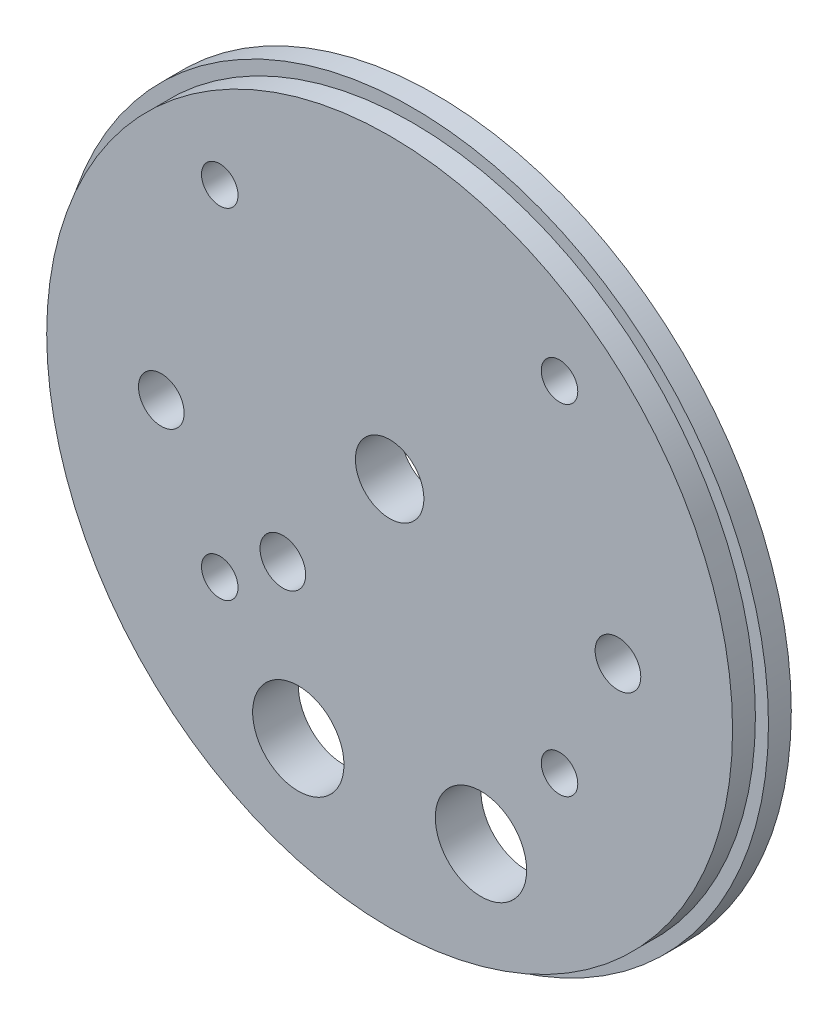
ISO-10303-21;
HEADER;
FILE_DESCRIPTION(('STEP AP214'),'2;1');
FILE_NAME('part.step','',(''),(''),'','','');
FILE_SCHEMA(('AUTOMOTIVE_DESIGN { 1 0 10303 214 1 1 1 1 }'));
ENDSEC;
DATA;
#1=APPLICATION_CONTEXT('core data for automotive mechanical design processes');
#2=APPLICATION_PROTOCOL_DEFINITION('international standard','automotive_design',2000,#1);
#3=PRODUCT_CONTEXT('',#1,'mechanical');
#4=PRODUCT('Part','Part','',(#3));
#5=PRODUCT_RELATED_PRODUCT_CATEGORY('part','',(#4));
#6=PRODUCT_DEFINITION_FORMATION('','',#4);
#7=PRODUCT_DEFINITION_CONTEXT('part definition',#1,'design');
#8=PRODUCT_DEFINITION('design','',#6,#7);
#9=PRODUCT_DEFINITION_SHAPE('','',#8);
#10=(LENGTH_UNIT() NAMED_UNIT(*) SI_UNIT(.MILLI.,.METRE.));
#11=(NAMED_UNIT(*) PLANE_ANGLE_UNIT() SI_UNIT($,.RADIAN.));
#12=(NAMED_UNIT(*) SI_UNIT($,.STERADIAN.) SOLID_ANGLE_UNIT());
#13=UNCERTAINTY_MEASURE_WITH_UNIT(LENGTH_MEASURE(1.E-05),#10,'distance_accuracy_value','');
#14=(GEOMETRIC_REPRESENTATION_CONTEXT(3) GLOBAL_UNCERTAINTY_ASSIGNED_CONTEXT((#13)) GLOBAL_UNIT_ASSIGNED_CONTEXT((#10,
#11,#12)) REPRESENTATION_CONTEXT('',''));
#15=CARTESIAN_POINT('',(0.,0.,0.));
#16=DIRECTION('',(0.,0.,1.));
#17=DIRECTION('',(1.,0.,0.));
#18=AXIS2_PLACEMENT_3D('',#15,#16,#17);
#19=CARTESIAN_POINT('',(0.,0.,3.175));
#20=DIRECTION('',(0.,0.,-1.));
#21=DIRECTION('',(-1.,0.,0.));
#22=AXIS2_PLACEMENT_3D('',#19,#20,#21);
#23=CYLINDRICAL_SURFACE('',#22,49.5046);
#24=CARTESIAN_POINT('',(0.,0.,3.175));
#25=DIRECTION('',(0.,0.,1.));
#26=DIRECTION('',(1.,0.,0.));
#27=AXIS2_PLACEMENT_3D('',#24,#25,#26);
#28=CIRCLE('',#27,49.5046);
#29=CARTESIAN_POINT('',(49.5046,0.,3.175));
#30=VERTEX_POINT('',#29);
#31=EDGE_CURVE('E42',#30,#30,#28,.T.);
#32=ORIENTED_EDGE('',*,*,#31,.F.);
#33=EDGE_LOOP('',(#32));
#34=FACE_BOUND('',#33,.T.);
#35=CARTESIAN_POINT('',(0.,0.,0.));
#36=DIRECTION('',(0.,0.,1.));
#37=DIRECTION('',(1.,0.,0.));
#38=AXIS2_PLACEMENT_3D('',#35,#36,#37);
#39=CIRCLE('',#38,49.5046);
#40=CARTESIAN_POINT('',(49.5046,0.,0.));
#41=VERTEX_POINT('',#40);
#42=EDGE_CURVE('E38',#41,#41,#39,.T.);
#43=ORIENTED_EDGE('',*,*,#42,.T.);
#44=EDGE_LOOP('',(#43));
#45=FACE_BOUND('',#44,.T.);
#46=ADVANCED_FACE('F35',(#34,#45),#23,.T.);
#47=CARTESIAN_POINT('',(0.,0.,3.175));
#48=DIRECTION('',(0.,0.,1.));
#49=DIRECTION('',(1.,0.,0.));
#50=AXIS2_PLACEMENT_3D('',#47,#48,#49);
#51=PLANE('',#50);
#52=CARTESIAN_POINT('',(0.,0.,3.175));
#53=DIRECTION('',(0.,0.,1.));
#54=DIRECTION('',(1.,0.,0.));
#55=AXIS2_PLACEMENT_3D('',#52,#53,#54);
#56=CIRCLE('',#55,47.6885);
#57=CARTESIAN_POINT('',(47.6885,0.,3.175));
#58=VERTEX_POINT('',#57);
#59=EDGE_CURVE('E10',#58,#58,#56,.T.);
#60=ORIENTED_EDGE('',*,*,#59,.F.);
#61=EDGE_LOOP('',(#60));
#62=FACE_BOUND('',#61,.T.);
#63=ORIENTED_EDGE('',*,*,#31,.T.);
#64=EDGE_LOOP('',(#63));
#65=FACE_BOUND('',#64,.T.);
#66=ADVANCED_FACE('F138',(#62,#65),#51,.T.);
#67=CARTESIAN_POINT('',(0.,0.,0.));
#68=DIRECTION('',(0.,0.,1.));
#69=DIRECTION('',(1.,0.,0.));
#70=AXIS2_PLACEMENT_3D('',#67,#68,#69);
#71=PLANE('',#70);
#72=CARTESIAN_POINT('',(-23.622,-17.272,0.));
#73=DIRECTION('',(0.,0.,1.));
#74=DIRECTION('',(1.,0.,0.));
#75=AXIS2_PLACEMENT_3D('',#72,#73,#74);
#76=CIRCLE('',#75,2.54);
#77=CARTESIAN_POINT('',(-21.082,-17.272,0.));
#78=VERTEX_POINT('',#77);
#79=EDGE_CURVE('E85',#78,#78,#76,.T.);
#80=ORIENTED_EDGE('',*,*,#79,.T.);
#81=EDGE_LOOP('',(#80));
#82=FACE_BOUND('',#81,.T.);
#83=CARTESIAN_POINT('',(23.622,-17.272,0.));
#84=DIRECTION('',(0.,0.,1.));
#85=DIRECTION('',(1.,0.,0.));
#86=AXIS2_PLACEMENT_3D('',#83,#84,#85);
#87=CIRCLE('',#86,2.54);
#88=CARTESIAN_POINT('',(26.162,-17.272,0.));
#89=VERTEX_POINT('',#88);
#90=EDGE_CURVE('E92',#89,#89,#87,.T.);
#91=ORIENTED_EDGE('',*,*,#90,.T.);
#92=EDGE_LOOP('',(#91));
#93=FACE_BOUND('',#92,.T.);
#94=CARTESIAN_POINT('',(23.622,29.972,0.));
#95=DIRECTION('',(0.,0.,1.));
#96=DIRECTION('',(1.,0.,0.));
#97=AXIS2_PLACEMENT_3D('',#94,#95,#96);
#98=CIRCLE('',#97,2.54);
#99=CARTESIAN_POINT('',(26.162,29.972,0.));
#100=VERTEX_POINT('',#99);
#101=EDGE_CURVE('E98',#100,#100,#98,.T.);
#102=ORIENTED_EDGE('',*,*,#101,.T.);
#103=EDGE_LOOP('',(#102));
#104=FACE_BOUND('',#103,.T.);
#105=CARTESIAN_POINT('',(-23.622,29.972,0.));
#106=DIRECTION('',(0.,0.,1.));
#107=DIRECTION('',(1.,0.,0.));
#108=AXIS2_PLACEMENT_3D('',#105,#106,#107);
#109=CIRCLE('',#108,2.54);
#110=CARTESIAN_POINT('',(-21.082,29.972,0.));
#111=VERTEX_POINT('',#110);
#112=EDGE_CURVE('E74',#111,#111,#109,.T.);
#113=ORIENTED_EDGE('',*,*,#112,.T.);
#114=EDGE_LOOP('',(#113));
#115=FACE_BOUND('',#114,.T.);
#116=CARTESIAN_POINT('',(12.7,-31.2353524431853,0.));
#117=DIRECTION('',(0.,0.,1.));
#118=DIRECTION('',(1.,0.,0.));
#119=AXIS2_PLACEMENT_3D('',#116,#117,#118);
#120=CIRCLE('',#119,6.35);
#121=CARTESIAN_POINT('',(19.05,-31.2353524431853,0.));
#122=VERTEX_POINT('',#121);
#123=EDGE_CURVE('E55',#122,#122,#120,.T.);
#124=ORIENTED_EDGE('',*,*,#123,.T.);
#125=EDGE_LOOP('',(#124));
#126=FACE_BOUND('',#125,.T.);
#127=CARTESIAN_POINT('',(-31.75,0.,0.));
#128=DIRECTION('',(0.,0.,1.));
#129=DIRECTION('',(1.,0.,0.));
#130=AXIS2_PLACEMENT_3D('',#127,#128,#129);
#131=CIRCLE('',#130,3.175);
#132=CARTESIAN_POINT('',(-28.575,0.,0.));
#133=VERTEX_POINT('',#132);
#134=EDGE_CURVE('E61',#133,#133,#131,.T.);
#135=ORIENTED_EDGE('',*,*,#134,.T.);
#136=EDGE_LOOP('',(#135));
#137=FACE_BOUND('',#136,.T.);
#138=CARTESIAN_POINT('',(31.75,0.,0.));
#139=DIRECTION('',(0.,0.,1.));
#140=DIRECTION('',(1.,0.,0.));
#141=AXIS2_PLACEMENT_3D('',#138,#139,#140);
#142=CIRCLE('',#141,3.17500000000001);
#143=CARTESIAN_POINT('',(34.925,0.,0.));
#144=VERTEX_POINT('',#143);
#145=EDGE_CURVE('E62',#144,#144,#142,.T.);
#146=ORIENTED_EDGE('',*,*,#145,.T.);
#147=EDGE_LOOP('',(#146));
#148=FACE_BOUND('',#147,.T.);
#149=CARTESIAN_POINT('',(-14.8503900513557,-11.029456703896,0.));
#150=DIRECTION('',(0.,0.,1.));
#151=DIRECTION('',(1.,0.,0.));
#152=AXIS2_PLACEMENT_3D('',#149,#150,#151);
#153=CIRCLE('',#152,3.175);
#154=CARTESIAN_POINT('',(-11.6753900513557,-11.029456703896,0.));
#155=VERTEX_POINT('',#154);
#156=EDGE_CURVE('E73',#155,#155,#153,.T.);
#157=ORIENTED_EDGE('',*,*,#156,.T.);
#158=EDGE_LOOP('',(#157));
#159=FACE_BOUND('',#158,.T.);
#160=CARTESIAN_POINT('',(0.,6.35,0.));
#161=DIRECTION('',(0.,0.,1.));
#162=DIRECTION('',(1.,0.,0.));
#163=AXIS2_PLACEMENT_3D('',#160,#161,#162);
#164=CIRCLE('',#163,4.7625);
#165=CARTESIAN_POINT('',(4.7625,6.35,0.));
#166=VERTEX_POINT('',#165);
#167=EDGE_CURVE('E86',#166,#166,#164,.T.);
#168=ORIENTED_EDGE('',*,*,#167,.T.);
#169=EDGE_LOOP('',(#168));
#170=FACE_BOUND('',#169,.T.);
#171=CARTESIAN_POINT('',(-12.7,-31.2353524431853,0.));
#172=DIRECTION('',(0.,0.,1.));
#173=DIRECTION('',(1.,0.,0.));
#174=AXIS2_PLACEMENT_3D('',#171,#172,#173);
#175=CIRCLE('',#174,6.35);
#176=CARTESIAN_POINT('',(-6.35,-31.2353524431853,0.));
#177=VERTEX_POINT('',#176);
#178=EDGE_CURVE('E51',#177,#177,#175,.T.);
#179=ORIENTED_EDGE('',*,*,#178,.T.);
#180=EDGE_LOOP('',(#179));
#181=FACE_BOUND('',#180,.T.);
#182=ORIENTED_EDGE('',*,*,#42,.F.);
#183=EDGE_LOOP('',(#182));
#184=FACE_BOUND('',#183,.T.);
#185=ADVANCED_FACE('F112',(#82,#93,#104,#115,#126,#137,#148,#159,#170,#181,#184),#71,.F.);
#186=CARTESIAN_POINT('',(0.,0.,6.35));
#187=DIRECTION('',(0.,0.,-1.));
#188=DIRECTION('',(-1.,0.,0.));
#189=AXIS2_PLACEMENT_3D('',#186,#187,#188);
#190=CYLINDRICAL_SURFACE('',#189,47.6885);
#191=CARTESIAN_POINT('',(0.,0.,6.35));
#192=DIRECTION('',(0.,0.,1.));
#193=DIRECTION('',(1.,0.,0.));
#194=AXIS2_PLACEMENT_3D('',#191,#192,#193);
#195=CIRCLE('',#194,47.6885);
#196=CARTESIAN_POINT('',(47.6885,0.,6.35));
#197=VERTEX_POINT('',#196);
#198=EDGE_CURVE('E48',#197,#197,#195,.T.);
#199=ORIENTED_EDGE('',*,*,#198,.F.);
#200=EDGE_LOOP('',(#199));
#201=FACE_BOUND('',#200,.T.);
#202=ORIENTED_EDGE('',*,*,#59,.T.);
#203=EDGE_LOOP('',(#202));
#204=FACE_BOUND('',#203,.T.);
#205=ADVANCED_FACE('F126',(#201,#204),#190,.T.);
#206=CARTESIAN_POINT('',(0.,0.,6.35));
#207=DIRECTION('',(0.,0.,1.));
#208=DIRECTION('',(1.,0.,0.));
#209=AXIS2_PLACEMENT_3D('',#206,#207,#208);
#210=PLANE('',#209);
#211=CARTESIAN_POINT('',(-23.622,-17.272,6.35));
#212=DIRECTION('',(0.,0.,1.));
#213=DIRECTION('',(1.,0.,0.));
#214=AXIS2_PLACEMENT_3D('',#211,#212,#213);
#215=CIRCLE('',#214,2.54);
#216=CARTESIAN_POINT('',(-21.082,-17.272,6.35));
#217=VERTEX_POINT('',#216);
#218=EDGE_CURVE('E82',#217,#217,#215,.T.);
#219=ORIENTED_EDGE('',*,*,#218,.F.);
#220=EDGE_LOOP('',(#219));
#221=FACE_BOUND('',#220,.T.);
#222=CARTESIAN_POINT('',(23.622,-17.272,6.35));
#223=DIRECTION('',(0.,0.,1.));
#224=DIRECTION('',(1.,0.,0.));
#225=AXIS2_PLACEMENT_3D('',#222,#223,#224);
#226=CIRCLE('',#225,2.54);
#227=CARTESIAN_POINT('',(26.162,-17.272,6.35));
#228=VERTEX_POINT('',#227);
#229=EDGE_CURVE('E89',#228,#228,#226,.T.);
#230=ORIENTED_EDGE('',*,*,#229,.F.);
#231=EDGE_LOOP('',(#230));
#232=FACE_BOUND('',#231,.T.);
#233=CARTESIAN_POINT('',(23.622,29.972,6.35));
#234=DIRECTION('',(0.,0.,1.));
#235=DIRECTION('',(1.,0.,0.));
#236=AXIS2_PLACEMENT_3D('',#233,#234,#235);
#237=CIRCLE('',#236,2.54);
#238=CARTESIAN_POINT('',(26.162,29.972,6.35));
#239=VERTEX_POINT('',#238);
#240=EDGE_CURVE('E95',#239,#239,#237,.T.);
#241=ORIENTED_EDGE('',*,*,#240,.F.);
#242=EDGE_LOOP('',(#241));
#243=FACE_BOUND('',#242,.T.);
#244=CARTESIAN_POINT('',(-23.622,29.972,6.35));
#245=DIRECTION('',(0.,0.,1.));
#246=DIRECTION('',(1.,0.,0.));
#247=AXIS2_PLACEMENT_3D('',#244,#245,#246);
#248=CIRCLE('',#247,2.54);
#249=CARTESIAN_POINT('',(-21.082,29.972,6.35));
#250=VERTEX_POINT('',#249);
#251=EDGE_CURVE('E101',#250,#250,#248,.T.);
#252=ORIENTED_EDGE('',*,*,#251,.F.);
#253=EDGE_LOOP('',(#252));
#254=FACE_BOUND('',#253,.T.);
#255=CARTESIAN_POINT('',(12.7,-31.2353524431853,6.35));
#256=DIRECTION('',(0.,0.,1.));
#257=DIRECTION('',(1.,0.,0.));
#258=AXIS2_PLACEMENT_3D('',#255,#256,#257);
#259=CIRCLE('',#258,6.35);
#260=CARTESIAN_POINT('',(19.05,-31.2353524431853,6.35));
#261=VERTEX_POINT('',#260);
#262=EDGE_CURVE('E65',#261,#261,#259,.T.);
#263=ORIENTED_EDGE('',*,*,#262,.F.);
#264=EDGE_LOOP('',(#263));
#265=FACE_BOUND('',#264,.T.);
#266=CARTESIAN_POINT('',(-31.75,0.,6.35));
#267=DIRECTION('',(0.,0.,1.));
#268=DIRECTION('',(1.,0.,0.));
#269=AXIS2_PLACEMENT_3D('',#266,#267,#268);
#270=CIRCLE('',#269,3.175);
#271=CARTESIAN_POINT('',(-28.575,0.,6.35));
#272=VERTEX_POINT('',#271);
#273=EDGE_CURVE('E58',#272,#272,#270,.T.);
#274=ORIENTED_EDGE('',*,*,#273,.F.);
#275=EDGE_LOOP('',(#274));
#276=FACE_BOUND('',#275,.T.);
#277=CARTESIAN_POINT('',(31.75,0.,6.35));
#278=DIRECTION('',(0.,0.,1.));
#279=DIRECTION('',(1.,0.,0.));
#280=AXIS2_PLACEMENT_3D('',#277,#278,#279);
#281=CIRCLE('',#280,3.17500000000001);
#282=CARTESIAN_POINT('',(34.925,0.,6.35));
#283=VERTEX_POINT('',#282);
#284=EDGE_CURVE('E77',#283,#283,#281,.T.);
#285=ORIENTED_EDGE('',*,*,#284,.F.);
#286=EDGE_LOOP('',(#285));
#287=FACE_BOUND('',#286,.T.);
#288=CARTESIAN_POINT('',(-14.8503900513557,-11.029456703896,6.35));
#289=DIRECTION('',(0.,0.,1.));
#290=DIRECTION('',(1.,0.,0.));
#291=AXIS2_PLACEMENT_3D('',#288,#289,#290);
#292=CIRCLE('',#291,3.175);
#293=CARTESIAN_POINT('',(-11.6753900513557,-11.029456703896,6.35));
#294=VERTEX_POINT('',#293);
#295=EDGE_CURVE('E70',#294,#294,#292,.T.);
#296=ORIENTED_EDGE('',*,*,#295,.F.);
#297=EDGE_LOOP('',(#296));
#298=FACE_BOUND('',#297,.T.);
#299=CARTESIAN_POINT('',(0.,6.35,6.35));
#300=DIRECTION('',(0.,0.,1.));
#301=DIRECTION('',(1.,0.,0.));
#302=AXIS2_PLACEMENT_3D('',#299,#300,#301);
#303=CIRCLE('',#302,4.7625);
#304=CARTESIAN_POINT('',(4.7625,6.35,6.35));
#305=VERTEX_POINT('',#304);
#306=EDGE_CURVE('E106',#305,#305,#303,.T.);
#307=ORIENTED_EDGE('',*,*,#306,.F.);
#308=EDGE_LOOP('',(#307));
#309=FACE_BOUND('',#308,.T.);
#310=CARTESIAN_POINT('',(-12.7,-31.2353524431853,6.35));
#311=DIRECTION('',(0.,0.,1.));
#312=DIRECTION('',(1.,0.,0.));
#313=AXIS2_PLACEMENT_3D('',#310,#311,#312);
#314=CIRCLE('',#313,6.35);
#315=CARTESIAN_POINT('',(-6.35,-31.2353524431853,6.35));
#316=VERTEX_POINT('',#315);
#317=EDGE_CURVE('E52',#316,#316,#314,.T.);
#318=ORIENTED_EDGE('',*,*,#317,.F.);
#319=EDGE_LOOP('',(#318));
#320=FACE_BOUND('',#319,.T.);
#321=ORIENTED_EDGE('',*,*,#198,.T.);
#322=EDGE_LOOP('',(#321));
#323=FACE_BOUND('',#322,.T.);
#324=ADVANCED_FACE('F123',(#221,#232,#243,#254,#265,#276,#287,#298,#309,#320,#323),#210,.T.);
#325=CARTESIAN_POINT('',(-12.7,-31.2353524431853,0.));
#326=DIRECTION('',(0.,0.,1.));
#327=DIRECTION('',(1.,0.,0.));
#328=AXIS2_PLACEMENT_3D('',#325,#326,#327);
#329=CYLINDRICAL_SURFACE('',#328,6.35);
#330=ORIENTED_EDGE('',*,*,#178,.F.);
#331=EDGE_LOOP('',(#330));
#332=FACE_BOUND('',#331,.T.);
#333=ORIENTED_EDGE('',*,*,#317,.T.);
#334=EDGE_LOOP('',(#333));
#335=FACE_BOUND('',#334,.T.);
#336=ADVANCED_FACE('F119',(#332,#335),#329,.F.);
#337=CARTESIAN_POINT('',(0.,6.35,0.));
#338=DIRECTION('',(0.,0.,1.));
#339=DIRECTION('',(1.,0.,0.));
#340=AXIS2_PLACEMENT_3D('',#337,#338,#339);
#341=CYLINDRICAL_SURFACE('',#340,4.7625);
#342=ORIENTED_EDGE('',*,*,#167,.F.);
#343=EDGE_LOOP('',(#342));
#344=FACE_BOUND('',#343,.T.);
#345=ORIENTED_EDGE('',*,*,#306,.T.);
#346=EDGE_LOOP('',(#345));
#347=FACE_BOUND('',#346,.T.);
#348=ADVANCED_FACE('F115',(#344,#347),#341,.F.);
#349=CARTESIAN_POINT('',(-14.8503900513557,-11.029456703896,0.));
#350=DIRECTION('',(0.,0.,1.));
#351=DIRECTION('',(1.,0.,0.));
#352=AXIS2_PLACEMENT_3D('',#349,#350,#351);
#353=CYLINDRICAL_SURFACE('',#352,3.175);
#354=ORIENTED_EDGE('',*,*,#156,.F.);
#355=EDGE_LOOP('',(#354));
#356=FACE_BOUND('',#355,.T.);
#357=ORIENTED_EDGE('',*,*,#295,.T.);
#358=EDGE_LOOP('',(#357));
#359=FACE_BOUND('',#358,.T.);
#360=ADVANCED_FACE('F118',(#356,#359),#353,.F.);
#361=CARTESIAN_POINT('',(31.75,0.,0.));
#362=DIRECTION('',(0.,0.,1.));
#363=DIRECTION('',(1.,0.,0.));
#364=AXIS2_PLACEMENT_3D('',#361,#362,#363);
#365=CYLINDRICAL_SURFACE('',#364,3.17500000000001);
#366=ORIENTED_EDGE('',*,*,#145,.F.);
#367=EDGE_LOOP('',(#366));
#368=FACE_BOUND('',#367,.T.);
#369=ORIENTED_EDGE('',*,*,#284,.T.);
#370=EDGE_LOOP('',(#369));
#371=FACE_BOUND('',#370,.T.);
#372=ADVANCED_FACE('F191',(#368,#371),#365,.F.);
#373=CARTESIAN_POINT('',(-31.75,0.,0.));
#374=DIRECTION('',(0.,0.,1.));
#375=DIRECTION('',(1.,0.,0.));
#376=AXIS2_PLACEMENT_3D('',#373,#374,#375);
#377=CYLINDRICAL_SURFACE('',#376,3.175);
#378=ORIENTED_EDGE('',*,*,#134,.F.);
#379=EDGE_LOOP('',(#378));
#380=FACE_BOUND('',#379,.T.);
#381=ORIENTED_EDGE('',*,*,#273,.T.);
#382=EDGE_LOOP('',(#381));
#383=FACE_BOUND('',#382,.T.);
#384=ADVANCED_FACE('F201',(#380,#383),#377,.F.);
#385=CARTESIAN_POINT('',(12.7,-31.2353524431853,0.));
#386=DIRECTION('',(0.,0.,1.));
#387=DIRECTION('',(1.,0.,0.));
#388=AXIS2_PLACEMENT_3D('',#385,#386,#387);
#389=CYLINDRICAL_SURFACE('',#388,6.35);
#390=ORIENTED_EDGE('',*,*,#123,.F.);
#391=EDGE_LOOP('',(#390));
#392=FACE_BOUND('',#391,.T.);
#393=ORIENTED_EDGE('',*,*,#262,.T.);
#394=EDGE_LOOP('',(#393));
#395=FACE_BOUND('',#394,.T.);
#396=ADVANCED_FACE('F211',(#392,#395),#389,.F.);
#397=CARTESIAN_POINT('',(-23.622,29.972,0.));
#398=DIRECTION('',(0.,0.,1.));
#399=DIRECTION('',(1.,0.,0.));
#400=AXIS2_PLACEMENT_3D('',#397,#398,#399);
#401=CYLINDRICAL_SURFACE('',#400,2.54);
#402=ORIENTED_EDGE('',*,*,#112,.F.);
#403=EDGE_LOOP('',(#402));
#404=FACE_BOUND('',#403,.T.);
#405=ORIENTED_EDGE('',*,*,#251,.T.);
#406=EDGE_LOOP('',(#405));
#407=FACE_BOUND('',#406,.T.);
#408=ADVANCED_FACE('F221',(#404,#407),#401,.F.);
#409=CARTESIAN_POINT('',(23.622,29.972,0.));
#410=DIRECTION('',(0.,0.,1.));
#411=DIRECTION('',(1.,0.,0.));
#412=AXIS2_PLACEMENT_3D('',#409,#410,#411);
#413=CYLINDRICAL_SURFACE('',#412,2.54);
#414=ORIENTED_EDGE('',*,*,#101,.F.);
#415=EDGE_LOOP('',(#414));
#416=FACE_BOUND('',#415,.T.);
#417=ORIENTED_EDGE('',*,*,#240,.T.);
#418=EDGE_LOOP('',(#417));
#419=FACE_BOUND('',#418,.T.);
#420=ADVANCED_FACE('F231',(#416,#419),#413,.F.);
#421=CARTESIAN_POINT('',(23.622,-17.272,0.));
#422=DIRECTION('',(0.,0.,1.));
#423=DIRECTION('',(1.,0.,0.));
#424=AXIS2_PLACEMENT_3D('',#421,#422,#423);
#425=CYLINDRICAL_SURFACE('',#424,2.54);
#426=ORIENTED_EDGE('',*,*,#90,.F.);
#427=EDGE_LOOP('',(#426));
#428=FACE_BOUND('',#427,.T.);
#429=ORIENTED_EDGE('',*,*,#229,.T.);
#430=EDGE_LOOP('',(#429));
#431=FACE_BOUND('',#430,.T.);
#432=ADVANCED_FACE('F241',(#428,#431),#425,.F.);
#433=CARTESIAN_POINT('',(-23.622,-17.272,0.));
#434=DIRECTION('',(0.,0.,1.));
#435=DIRECTION('',(1.,0.,0.));
#436=AXIS2_PLACEMENT_3D('',#433,#434,#435);
#437=CYLINDRICAL_SURFACE('',#436,2.54);
#438=ORIENTED_EDGE('',*,*,#79,.F.);
#439=EDGE_LOOP('',(#438));
#440=FACE_BOUND('',#439,.T.);
#441=ORIENTED_EDGE('',*,*,#218,.T.);
#442=EDGE_LOOP('',(#441));
#443=FACE_BOUND('',#442,.T.);
#444=ADVANCED_FACE('F251',(#440,#443),#437,.F.);
#445=CLOSED_SHELL('',(#46,#66,#185,#205,#324,#336,#348,#360,#372,#384,#396,#408,#420,#432,#444));
#446=MANIFOLD_SOLID_BREP('B2',#445);
#447=ADVANCED_BREP_SHAPE_REPRESENTATION('',(#18,#446),#14);
#448=SHAPE_DEFINITION_REPRESENTATION(#9,#447);
ENDSEC;
END-ISO-10303-21;
